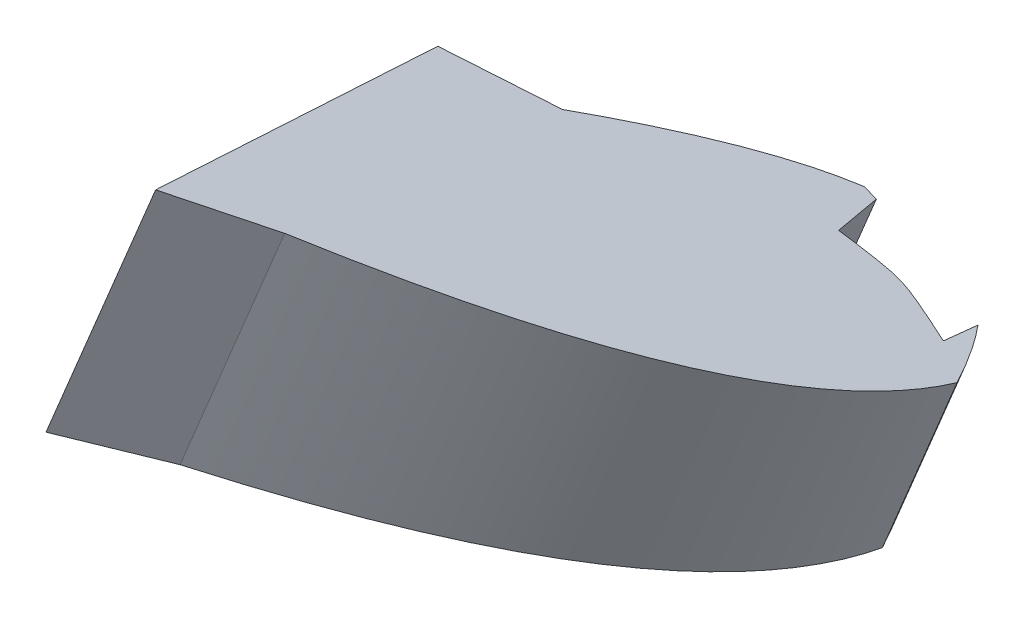
ISO-10303-21;
HEADER;
FILE_DESCRIPTION(('STEP AP214'),'2;1');
FILE_NAME('part.step','',(''),(''),'','','');
FILE_SCHEMA(('AUTOMOTIVE_DESIGN { 1 0 10303 214 1 1 1 1 }'));
ENDSEC;
DATA;
#1=APPLICATION_CONTEXT('core data for automotive mechanical design processes');
#2=APPLICATION_PROTOCOL_DEFINITION('international standard','automotive_design',2000,#1);
#3=PRODUCT_CONTEXT('',#1,'mechanical');
#4=PRODUCT('Part','Part','',(#3));
#5=PRODUCT_RELATED_PRODUCT_CATEGORY('part','',(#4));
#6=PRODUCT_DEFINITION_FORMATION('','',#4);
#7=PRODUCT_DEFINITION_CONTEXT('part definition',#1,'design');
#8=PRODUCT_DEFINITION('design','',#6,#7);
#9=PRODUCT_DEFINITION_SHAPE('','',#8);
#10=(LENGTH_UNIT() NAMED_UNIT(*) SI_UNIT(.MILLI.,.METRE.));
#11=(NAMED_UNIT(*) PLANE_ANGLE_UNIT() SI_UNIT($,.RADIAN.));
#12=(NAMED_UNIT(*) SI_UNIT($,.STERADIAN.) SOLID_ANGLE_UNIT());
#13=UNCERTAINTY_MEASURE_WITH_UNIT(LENGTH_MEASURE(1.E-05),#10,'distance_accuracy_value','');
#14=(GEOMETRIC_REPRESENTATION_CONTEXT(3) GLOBAL_UNCERTAINTY_ASSIGNED_CONTEXT((#13)) GLOBAL_UNIT_ASSIGNED_CONTEXT((#10,
#11,#12)) REPRESENTATION_CONTEXT('',''));
#15=CARTESIAN_POINT('',(0.,0.,0.));
#16=DIRECTION('',(0.,0.,1.));
#17=DIRECTION('',(1.,0.,0.));
#18=AXIS2_PLACEMENT_3D('',#15,#16,#17);
#19=CARTESIAN_POINT('',(-43.998126423093,-18.8210306000009,2.499999999937));
#20=CARTESIAN_POINT('',(-40.0767587944714,-9.35401168793164,2.49999999995365));
#21=CARTESIAN_POINT('',(-46.7697650206304,-17.6729803029027,1.80379381403451));
#22=CARTESIAN_POINT('',(-42.8483973920088,-8.20596139083351,1.80379381405073));
#23=CARTESIAN_POINT('',(-49.5414036181607,-16.5249300058104,2.49999999997486));
#24=CARTESIAN_POINT('',(-45.620035989539,-7.05791109374113,2.49999999999428));
#25=(BOUNDED_SURFACE() B_SPLINE_SURFACE(2,1,((#19,#20),(#21,#22),(#23,#24)),.UNSPECIFIED.,.F.,
.F.,.F.) B_SPLINE_SURFACE_WITH_KNOTS((3,3),(2,2),(0.,1.),(0.,1.),
.UNSPECIFIED.) GEOMETRIC_REPRESENTATION_ITEM() RATIONAL_B_SPLINE_SURFACE(((1.,1.),
(3.23180121851367,3.23180121851367),(1.,1.))) REPRESENTATION_ITEM('') SURFACE());
#26=DIRECTION('',(0.382683432365087,0.923879532511289,1.75275773725978E-12));
#27=VECTOR('',#26,1.);
#28=CARTESIAN_POINT('',(-45.864276932433,-23.3263164690792,2.49999999992723));
#29=LINE('',#28,#27);
#30=CARTESIAN_POINT('',(-43.9748772079036,-18.7649020293759,2.49999999993722));
#31=VERTEX_POINT('',#30);
#32=CARTESIAN_POINT('',(-40.1000080096608,-9.41014025855653,2.49999999995354));
#33=VERTEX_POINT('',#32);
#34=EDGE_CURVE('E11',#31,#33,#29,.T.);
#35=CARTESIAN_POINT('',(-43.9748772079036,-18.764902029376,2.4999999999371));
#36=CARTESIAN_POINT('',(-44.1441960060012,-18.689918733038,2.45713397755878));
#37=CARTESIAN_POINT('',(-44.3136175517458,-18.6150463287689,2.41445643723449));
#38=CARTESIAN_POINT('',(-44.6359575068058,-18.4727763861975,2.33457287865682));
#39=CARTESIAN_POINT('',(-44.7888439602414,-18.4053749317663,2.29724438388191));
#40=CARTESIAN_POINT('',(-45.0742294433284,-18.2796214469319,2.22925837496299));
#41=CARTESIAN_POINT('',(-45.2066814513427,-18.2212818149999,2.1983827102511));
#42=CARTESIAN_POINT('',(-45.4526073408195,-18.1130940658739,2.14333724545787));
#43=CARTESIAN_POINT('',(-45.5660134530771,-18.0632563608652,2.11884832964651));
#44=CARTESIAN_POINT('',(-45.7775214336354,-17.9705727676006,2.07609221582717));
#45=CARTESIAN_POINT('',(-45.8755418307185,-17.927725396652,2.05743401061641));
#46=CARTESIAN_POINT('',(-46.0607637056918,-17.8471864953704,2.02581754669822));
#47=CARTESIAN_POINT('',(-46.1478861685699,-17.8094794863191,2.01244747500349));
#48=CARTESIAN_POINT('',(-46.3162287827627,-17.7371953870861,1.99108008471293));
#49=CARTESIAN_POINT('',(-46.3973955462451,-17.702597773863,1.98275223549235));
#50=CARTESIAN_POINT('',(-46.5188363833495,-17.6513253521998,1.97426315887402));
#51=CARTESIAN_POINT('',(-46.5589036571399,-17.6344882757561,1.97210265216576));
#52=CARTESIAN_POINT('',(-46.6398136583234,-17.6006492441863,1.96913761535577));
#53=CARTESIAN_POINT('',(-46.6806581006547,-17.5836492740698,1.96835648568599));
#54=CARTESIAN_POINT('',(-46.7626125151756,-17.5496922512491,1.96827010909868));
#55=CARTESIAN_POINT('',(-46.8037227731986,-17.5327358681264,1.96897246785804));
#56=CARTESIAN_POINT('',(-46.8852220843218,-17.499284862902,1.97179855206847));
#57=CARTESIAN_POINT('',(-46.9256108921239,-17.4827874049344,1.97389664334203));
#58=CARTESIAN_POINT('',(-47.0480851518441,-17.4330030916098,1.9822143196582));
#59=CARTESIAN_POINT('',(-47.1301416280285,-17.3999783523466,1.9904525415166));
#60=CARTESIAN_POINT('',(-47.3006186280489,-17.3318982709867,2.01167618877233));
#61=CARTESIAN_POINT('',(-47.3890162497119,-17.2968951337547,2.02499209529751));
#62=CARTESIAN_POINT('',(-47.5771926486817,-17.2227573615089,2.05652581112926));
#63=CARTESIAN_POINT('',(-47.6769263608098,-17.1836903127165,2.07515947465734));
#64=CARTESIAN_POINT('',(-47.8923267176656,-17.0995431023758,2.11789459919859));
#65=CARTESIAN_POINT('',(-48.0079362808746,-17.0545225292304,2.14239207411723));
#66=CARTESIAN_POINT('',(-48.2588052621067,-16.956941927987,2.19749261293181));
#67=CARTESIAN_POINT('',(-48.3940087123079,-16.9044231441774,2.22841930403345));
#68=CARTESIAN_POINT('',(-48.6854862403636,-16.7912530982723,2.29655705054913));
#69=CARTESIAN_POINT('',(-48.8417176713024,-16.730626649588,2.33398953120001));
#70=CARTESIAN_POINT('',(-49.1713624408446,-16.6028664941779,2.41413558094473));
#71=CARTESIAN_POINT('',(-49.3447555644009,-16.5357584450804,2.45697371596278));
#72=CARTESIAN_POINT('',(-49.5181544029712,-16.4688014351855,2.49999999997497));
#73=B_SPLINE_CURVE_WITH_KNOTS('',3,(#35,#36,#37,#38,#39,#40,#41,#42,#43,#44,#45,#46,#47,#48,#49,
#50,#51,#52,#53,#54,#55,#56,#57,#58,#59,#60,#61,#62,#63,#64,#65,#66,#67,#68,#69,#70,#71,#72),
.UNSPECIFIED.,.F.,.F.,(4,2,2,2,2,2,2,2,2,2,2,2,2,2,2,2,2,2,4),(0.,0.570235625834093,
1.08384226862801,1.52779463893683,1.90658850363396,2.23232117936545,2.51986191967893,
2.78559885868057,2.91612402279601,3.04884294558912,3.18224395442222,3.31326015892368,
3.57962600844266,3.86756816419204,4.19368983241728,4.57305425999804,5.01796126879909,
5.53309339380046,6.10547806856563),.UNSPECIFIED.);
#74=CARTESIAN_POINT('',(-49.5181544029713,-16.4688014351855,2.49999999997508));
#75=VERTEX_POINT('',#74);
#76=EDGE_CURVE('E252',#31,#75,#73,.T.);
#77=DIRECTION('',(0.382683432365087,0.923879532511289,1.75275773725978E-12));
#78=VECTOR('',#77,1.);
#79=CARTESIAN_POINT('',(-51.4075541275007,-21.0302158748886,2.49999999996642));
#80=LINE('',#79,#78);
#81=CARTESIAN_POINT('',(-45.6432852047285,-7.11403966436603,2.49999999999273));
#82=VERTEX_POINT('',#81);
#83=EDGE_CURVE('E52',#75,#82,#80,.T.);
#84=CARTESIAN_POINT('',(-45.6432852047284,-7.11403966436603,2.49999999999417));
#85=CARTESIAN_POINT('',(-45.4733034039699,-7.18931630580198,2.4569675417673));
#86=CARTESIAN_POINT('',(-45.3032189480743,-7.26448235222831,2.41412323266543));
#87=CARTESIAN_POINT('',(-44.9797547751153,-7.40725055057055,2.33396999929756));
#88=CARTESIAN_POINT('',(-44.8264075243227,-7.47485652730423,2.29653634702487));
#89=CARTESIAN_POINT('',(-44.540275852894,-7.60094123098431,2.2283985926996));
#90=CARTESIAN_POINT('',(-44.4075391578326,-7.65940733774079,2.19747294584205));
#91=CARTESIAN_POINT('',(-44.1611568564664,-7.76779555418798,2.14237528386857));
#92=CARTESIAN_POINT('',(-44.0475800131611,-7.81770726825742,2.11787956211104));
#93=CARTESIAN_POINT('',(-43.835779768405,-7.9105123545508,2.07514796784309));
#94=CARTESIAN_POINT('',(-43.7376388839356,-7.95340753239485,2.05651604976666));
#95=CARTESIAN_POINT('',(-43.5521662786991,-8.0340396877104,2.02498550751966));
#96=CARTESIAN_POINT('',(-43.4649142253352,-8.07179262568208,2.01167104000487));
#97=CARTESIAN_POINT('',(-43.2962392223354,-8.14419277446475,1.99044978823388));
#98=CARTESIAN_POINT('',(-43.2148693849369,-8.1788607298707,1.98221255575299));
#99=CARTESIAN_POINT('',(-43.0930714197467,-8.23025602250833,1.97389591118496));
#100=CARTESIAN_POINT('',(-43.0528491419495,-8.24714831805179,1.97179808805002));
#101=CARTESIAN_POINT('',(-42.9715718988664,-8.28112057993104,1.96897237467957));
#102=CARTESIAN_POINT('',(-42.9305151017157,-8.29819836659283,1.96827011169426));
#103=CARTESIAN_POINT('',(-42.8485529735578,-8.33213674397041,1.96835648882383));
#104=CARTESIAN_POINT('',(-42.8076479069075,-8.34899799286531,1.96913771915974));
#105=CARTESIAN_POINT('',(-42.726502495027,-8.38228352649912,1.97210313432568));
#106=CARTESIAN_POINT('',(-42.6862623401667,-8.39871042684879,1.97426391219909));
#107=CARTESIAN_POINT('',(-42.5641274909734,-8.44832910065065,1.98275402802418));
#108=CARTESIAN_POINT('',(-42.4822643465258,-8.48125998905372,1.99108286912407));
#109=CARTESIAN_POINT('',(-42.3121044342377,-8.54918710325134,2.01245265709763));
#110=CARTESIAN_POINT('',(-42.2238309201739,-8.58413108622148,2.02582416716595));
#111=CARTESIAN_POINT('',(-42.0358977565996,-8.6581575078905,2.05744380077621));
#112=CARTESIAN_POINT('',(-41.9362830514792,-8.6971731622801,2.07610374775436));
#113=CARTESIAN_POINT('',(-41.7211752899773,-8.78119960892744,2.11886338047349));
#114=CARTESIAN_POINT('',(-41.605738803833,-8.82615178030273,2.14335404180078));
#115=CARTESIAN_POINT('',(-41.355334358614,-8.92355137707166,2.19840236424116));
#116=CARTESIAN_POINT('',(-41.2204216763491,-8.97595827230207,2.22927906232333));
#117=CARTESIAN_POINT('',(-40.9297060404861,-9.0888348640838,2.29726504433471));
#118=CARTESIAN_POINT('',(-40.7739450795168,-9.14928008813858,2.33459236050748));
#119=CARTESIAN_POINT('',(-40.4454475084613,-9.27659763911505,2.41446874653152));
#120=CARTESIAN_POINT('',(-40.2727306885249,-9.34344460497427,2.45714013285186));
#121=CARTESIAN_POINT('',(-40.1000080096608,-9.41014025855653,2.49999999995355));
#122=B_SPLINE_CURVE_WITH_KNOTS('',3,(#84,#85,#86,#87,#88,#89,#90,#91,#92,#93,#94,#95,#96,#97,
#98,#99,#100,#101,#102,#103,#104,#105,#106,#107,#108,#109,#110,#111,#112,#113,#114,#115,#116,
#117,#118,#119,#120,#121),.UNSPECIFIED.,.F.,.F.,(4,2,2,2,2,2,2,2,2,2,2,2,2,2,2,2,2,2,4),(0.,
0.572467369661266,1.08761878874473,1.53251624400828,1.91186132912143,2.23796253212292,
2.52588605971483,2.7922350840849,2.92324298910506,3.05663520072196,3.18936289457909,
3.31989635304015,3.58565013279023,3.87320951547109,4.19896263990151,4.57777577935391,
5.02173759074604,5.53532487454691,6.10547806999696),.UNSPECIFIED.);
#123=EDGE_CURVE('E211',#33,#82,#122,.F.);
#124=ORIENTED_EDGE('',*,*,#34,.F.);
#125=ORIENTED_EDGE('',*,*,#76,.T.);
#126=ORIENTED_EDGE('',*,*,#83,.T.);
#127=ORIENTED_EDGE('',*,*,#123,.F.);
#128=EDGE_LOOP('',(#124,#125,#126,#127));
#129=FACE_BOUND('',#128,.T.);
#130=ADVANCED_FACE('F16',(#129),#25,.T.);
#131=CARTESIAN_POINT('',(-45.864276932433,-23.3263164690792,2.49999999992723));
#132=DIRECTION('',(-0.923316730062639,0.382450311957987,-0.0348994966965405));
#133=DIRECTION('',(-0.0377709966946393,0.,0.999286421307068));
#134=AXIS2_PLACEMENT_3D('',#131,#132,#133);
#135=PLANE('',#134);
#136=DIRECTION('',(0.382683432365087,0.923879532511289,1.75275773725978E-12));
#137=VECTOR('',#136,1.);
#138=CARTESIAN_POINT('',(-45.8046947616248,-23.3509962123001,0.653211709660262));
#139=LINE('',#138,#137);
#140=CARTESIAN_POINT('',(-43.8410141738853,-18.6102518822556,0.653211709669255));
#141=VERTEX_POINT('',#140);
#142=CARTESIAN_POINT('',(-40.1147067182942,-9.61414988539547,0.653211709686241));
#143=VERTEX_POINT('',#142);
#144=EDGE_CURVE('E29',#141,#143,#139,.T.);
#145=ORIENTED_EDGE('',*,*,#144,.F.);
#146=DIRECTION('',(-0.0720437233054021,-0.0832311361385315,0.993922673002974));
#147=VECTOR('',#146,1.);
#148=CARTESIAN_POINT('',(-44.0120352781172,-18.8078302437812,3.01263658749673));
#149=LINE('',#148,#147);
#150=EDGE_CURVE('E244',#141,#31,#149,.T.);
#151=ORIENTED_EDGE('',*,*,#150,.T.);
#152=ORIENTED_EDGE('',*,*,#34,.T.);
#153=DIRECTION('',(0.00791069547691085,0.109795906057388,0.99392267300334));
#154=VECTOR('',#153,1.);
#155=CARTESIAN_POINT('',(-40.112455793967,-9.58290834959068,0.936024356267606));
#156=LINE('',#155,#154);
#157=EDGE_CURVE('E274',#143,#33,#156,.T.);
#158=ORIENTED_EDGE('',*,*,#157,.F.);
#159=EDGE_LOOP('',(#145,#151,#152,#158));
#160=FACE_BOUND('',#159,.T.);
#161=ADVANCED_FACE('F324',(#160),#135,.T.);
#162=CARTESIAN_POINT('',(-42.3892208390751,-19.5986096640974,3.46542473270606));
#163=CARTESIAN_POINT('',(-38.3892593165955,-9.94184830755682,3.46542473272426));
#164=CARTESIAN_POINT('',(-43.1578042398419,-19.2802519956817,1.74103164453687));
#165=CARTESIAN_POINT('',(-39.1578427173624,-9.62349063914111,1.74103164455508));
#166=CARTESIAN_POINT('',(-43.9778412024725,-18.9405815641108,0.653211705365475));
#167=CARTESIAN_POINT('',(-39.977879679993,-9.28382020757025,0.653211705383794));
#168=(BOUNDED_SURFACE() B_SPLINE_SURFACE(2,1,((#162,#163),(#164,#165),(#166,#167)),
.UNSPECIFIED.,.F.,.F.,.F.) B_SPLINE_SURFACE_WITH_KNOTS((3,3),(2,2),(0.498970870983995,
0.499370559848929),(0.,1.),
.UNSPECIFIED.) GEOMETRIC_REPRESENTATION_ITEM() RATIONAL_B_SPLINE_SURFACE(((1.,1.),(1.,1.),(1.,1.))) REPRESENTATION_ITEM('') SURFACE());
#169=DIRECTION('',(0.382683432365087,0.923879532511289,1.75275773725978E-12));
#170=VECTOR('',#169,1.);
#171=CARTESIAN_POINT('',(-44.2160744002341,-24.0090243114554,3.46542473202216));
#172=LINE('',#171,#170);
#173=CARTESIAN_POINT('',(-42.3655056521761,-19.5413561382697,3.4654247326813));
#174=VERTEX_POINT('',#173);
#175=CARTESIAN_POINT('',(-38.4129745034929,-9.99910183338225,3.46542473266931));
#176=VERTEX_POINT('',#175);
#177=EDGE_CURVE('E188',#174,#176,#172,.T.);
#178=CARTESIAN_POINT('',(-42.3655056521761,-19.5413561382697,3.4654247326813));
#179=CARTESIAN_POINT('',(-42.8316559674868,-19.2174877790016,2.31582932975005));
#180=CARTESIAN_POINT('',(-43.323492140092,-18.9071196942011,1.37842499130636));
#181=CARTESIAN_POINT('',(-43.8410141738853,-18.6102518822556,0.653211709669255));
#182=(BOUNDED_CURVE() B_SPLINE_CURVE(3,(#178,#179,#180,#181),.UNSPECIFIED.,.F.,
.F.) B_SPLINE_CURVE_WITH_KNOTS((4,4),(0.,1.),
.UNSPECIFIED.) CURVE() GEOMETRIC_REPRESENTATION_ITEM() RATIONAL_B_SPLINE_CURVE((1.,1.,1.,1.)) REPRESENTATION_ITEM(''));
#183=EDGE_CURVE('E254',#174,#141,#182,.T.);
#184=CARTESIAN_POINT('',(-38.4129745034929,-9.99910183338225,3.46542473266931));
#185=CARTESIAN_POINT('',(-38.9716020722142,-9.89849329622184,2.31582931598706));
#186=CARTESIAN_POINT('',(-39.5388461438147,-9.77017598022625,1.37842497499419));
#187=CARTESIAN_POINT('',(-40.1147067182942,-9.61414988539547,0.653211709686241));
#188=(BOUNDED_CURVE() B_SPLINE_CURVE(3,(#184,#185,#186,#187),.UNSPECIFIED.,.F.,
.F.) B_SPLINE_CURVE_WITH_KNOTS((4,4),(0.,1.),
.UNSPECIFIED.) CURVE() GEOMETRIC_REPRESENTATION_ITEM() RATIONAL_B_SPLINE_CURVE((1.,1.,1.,1.)) REPRESENTATION_ITEM(''));
#189=EDGE_CURVE('E267',#176,#143,#188,.T.);
#190=ORIENTED_EDGE('',*,*,#177,.F.);
#191=ORIENTED_EDGE('',*,*,#183,.T.);
#192=ORIENTED_EDGE('',*,*,#144,.T.);
#193=ORIENTED_EDGE('',*,*,#189,.F.);
#194=EDGE_LOOP('',(#190,#191,#192,#193));
#195=FACE_BOUND('',#194,.T.);
#196=ADVANCED_FACE('F235',(#195),#168,.T.);
#197=CARTESIAN_POINT('',(-59.8232234491169,-14.651748478847,23.2218347925675));
#198=CARTESIAN_POINT('',(-54.2149198750995,-1.11210592854838,23.2218347925931));
#199=CARTESIAN_POINT('',(-45.0003686640836,-20.791575963874,12.2908756265575));
#200=CARTESIAN_POINT('',(-39.3920650900662,-7.25193341357539,12.2908756265832));
#201=CARTESIAN_POINT('',(-43.1933918638165,-21.5400502614214,3.4654247328888));
#202=CARTESIAN_POINT('',(-37.5850882897991,-8.00040771112283,3.465424732913));
#203=(BOUNDED_SURFACE() B_SPLINE_SURFACE(2,1,((#197,#198),(#199,#200),(#201,#202)),
.UNSPECIFIED.,.F.,.F.,.F.) B_SPLINE_SURFACE_WITH_KNOTS((3,3),(2,2),(0.497683812669217,
0.499570923629333),(0.,1.),
.UNSPECIFIED.) GEOMETRIC_REPRESENTATION_ITEM() RATIONAL_B_SPLINE_SURFACE(((1.,1.),(1.,1.),(1.,1.))) REPRESENTATION_ITEM('') SURFACE());
#204=DIRECTION('',(0.382683432365087,0.923879532511289,1.75275773725978E-12));
#205=VECTOR('',#204,1.);
#206=CARTESIAN_POINT('',(-60.8459059857371,-17.1207225287971,23.2218347925797));
#207=LINE('',#206,#205);
#208=CARTESIAN_POINT('',(-59.7899726373755,-14.5714739182552,23.2218347925977));
#209=VERTEX_POINT('',#208);
#210=CARTESIAN_POINT('',(-54.2481706867326,-1.19238048914556,23.2218347925717));
#211=VERTEX_POINT('',#210);
#212=EDGE_CURVE('E189',#209,#211,#207,.T.);
#213=CARTESIAN_POINT('',(-59.7899726373755,-14.5714739182552,23.2218347925977));
#214=CARTESIAN_POINT('',(-49.6149619940267,-17.9570682006105,15.934528695419));
#215=CARTESIAN_POINT('',(-43.8068063158397,-19.6136956140975,9.34905867292202));
#216=CARTESIAN_POINT('',(-42.3655056521761,-19.5413561382697,3.4654247326813));
#217=(BOUNDED_CURVE() B_SPLINE_CURVE(3,(#213,#214,#215,#216),.UNSPECIFIED.,.F.,
.F.) B_SPLINE_CURVE_WITH_KNOTS((4,4),(0.,1.),
.UNSPECIFIED.) CURVE() GEOMETRIC_REPRESENTATION_ITEM() RATIONAL_B_SPLINE_CURVE((1.,1.,1.,1.)) REPRESENTATION_ITEM(''));
#218=EDGE_CURVE('E286',#209,#174,#217,.T.);
#219=CARTESIAN_POINT('',(-54.2481706867326,-1.19238048914556,23.2218347925717));
#220=CARTESIAN_POINT('',(-44.6593749557795,-5.99322285379242,15.9345286718843));
#221=CARTESIAN_POINT('',(-39.3809762280331,-8.92879663520458,9.34905865191682));
#222=CARTESIAN_POINT('',(-38.4129745034929,-9.99910183338225,3.46542473266931));
#223=(BOUNDED_CURVE() B_SPLINE_CURVE(3,(#219,#220,#221,#222),.UNSPECIFIED.,.F.,
.F.) B_SPLINE_CURVE_WITH_KNOTS((4,4),(0.,1.),
.UNSPECIFIED.) CURVE() GEOMETRIC_REPRESENTATION_ITEM() RATIONAL_B_SPLINE_CURVE((1.,1.,1.,1.)) REPRESENTATION_ITEM(''));
#224=EDGE_CURVE('E166',#211,#176,#223,.T.);
#225=ORIENTED_EDGE('',*,*,#212,.F.);
#226=ORIENTED_EDGE('',*,*,#218,.T.);
#227=ORIENTED_EDGE('',*,*,#177,.T.);
#228=ORIENTED_EDGE('',*,*,#224,.F.);
#229=EDGE_LOOP('',(#225,#226,#227,#228));
#230=FACE_BOUND('',#229,.T.);
#231=ADVANCED_FACE('F310',(#230),#203,.T.);
#232=CARTESIAN_POINT('',(-60.8459059857371,-17.1207225287971,23.2218347925797));
#233=DIRECTION('',(0.584753402377201,-0.242212789909909,0.774206963810285));
#234=DIRECTION('',(-0.382683432367064,-0.923879532510469,0.));
#235=AXIS2_PLACEMENT_3D('',#232,#233,#234);
#236=PLANE('',#235);
#237=DIRECTION('',(0.382683432365087,0.923879532511289,1.75275773725978E-12));
#238=VECTOR('',#237,1.);
#239=CARTESIAN_POINT('',(-64.5414241159697,-15.5899887992652,26.4919294904875));
#240=LINE('',#239,#238);
#241=CARTESIAN_POINT('',(-63.6170193704147,-13.3582783254241,26.4919294904917));
#242=VERTEX_POINT('',#241);
#243=CARTESIAN_POINT('',(-57.8121602142231,0.655891377119524,26.4919294905183));
#244=VERTEX_POINT('',#243);
#245=EDGE_CURVE('E187',#242,#244,#240,.T.);
#246=ORIENTED_EDGE('',*,*,#245,.F.);
#247=DIRECTION('',(0.739097950907789,-0.234298256399335,-0.631536654527774));
#248=VECTOR('',#247,1.);
#249=CARTESIAN_POINT('',(-59.9253411391994,-14.5285613328371,23.3375030482709));
#250=LINE('',#249,#248);
#251=EDGE_CURVE('E165',#242,#209,#250,.T.);
#252=ORIENTED_EDGE('',*,*,#251,.T.);
#253=ORIENTED_EDGE('',*,*,#212,.T.);
#254=DIRECTION('',(0.688295058968979,-0.356947287125785,-0.631536654528006));
#255=VECTOR('',#254,1.);
#256=CARTESIAN_POINT('',(-53.4604927917755,-1.60086734964381,22.4991106408409));
#257=LINE('',#256,#255);
#258=EDGE_CURVE('E179',#244,#211,#257,.T.);
#259=ORIENTED_EDGE('',*,*,#258,.F.);
#260=EDGE_LOOP('',(#246,#252,#253,#259));
#261=FACE_BOUND('',#260,.T.);
#262=ADVANCED_FACE('F305',(#261),#236,.T.);
#263=CARTESIAN_POINT('',(-64.5414241159697,-15.5899887992652,26.4919294904875));
#264=DIRECTION('',(-0.923879532511288,0.382683432365088,6.5272817776803E-12));
#265=DIRECTION('',(7.06818712244004E-12,0.,0.999999999999997));
#266=AXIS2_PLACEMENT_3D('',#263,#264,#265);
#267=PLANE('',#266);
#268=DIRECTION('',(0.382683432365087,0.923879532511289,1.75275773725978E-12));
#269=VECTOR('',#268,1.);
#270=CARTESIAN_POINT('',(-64.5414241160534,-15.5899887992012,10.9277135759431));
#271=LINE('',#270,#269);
#272=CARTESIAN_POINT('',(-62.9910009331233,-11.8469361235537,10.9277135759501));
#273=VERTEX_POINT('',#272);
#274=CARTESIAN_POINT('',(-58.4381786516818,-0.855450824622867,10.927713575971));
#275=VERTEX_POINT('',#274);
#276=EDGE_CURVE('E137',#273,#275,#271,.T.);
#277=ORIENTED_EDGE('',*,*,#276,.F.);
#278=DIRECTION('',(-0.0400013110977776,-0.0965717077819282,0.994521895368088));
#279=VECTOR('',#278,1.);
#280=CARTESIAN_POINT('',(-63.6271196012051,-13.3826624395856,26.7430437763394));
#281=LINE('',#280,#279);
#282=EDGE_CURVE('E155',#273,#242,#281,.T.);
#283=ORIENTED_EDGE('',*,*,#282,.T.);
#284=ORIENTED_EDGE('',*,*,#245,.T.);
#285=DIRECTION('',(0.040001311108447,0.0965717077737515,0.994521895368454));
#286=VECTOR('',#285,1.);
#287=CARTESIAN_POINT('',(-57.8856854950071,0.47838564710456,24.6639268681882));
#288=LINE('',#287,#286);
#289=EDGE_CURVE('E183',#275,#244,#288,.T.);
#290=ORIENTED_EDGE('',*,*,#289,.F.);
#291=EDGE_LOOP('',(#277,#283,#284,#290));
#292=FACE_BOUND('',#291,.T.);
#293=ADVANCED_FACE('F315',(#292),#267,.T.);
#294=CARTESIAN_POINT('',(-60.2552211978261,-17.3653921790094,8.51725167506867));
#295=DIRECTION('',(-0.425955925733507,0.176436721413681,-0.887373446001906));
#296=DIRECTION('',(-0.901516449808071,0.,0.432744833274121));
#297=AXIS2_PLACEMENT_3D('',#294,#295,#296);
#298=PLANE('',#297);
#299=DIRECTION('',(0.382683432365087,0.923879532511289,1.75275773725978E-12));
#300=VECTOR('',#299,1.);
#301=CARTESIAN_POINT('',(-60.2552212065647,-17.3653921753898,8.51725168689144));
#302=LINE('',#301,#300);
#303=CARTESIAN_POINT('',(-58.6078452701051,-13.3882748472621,8.51725167999051));
#304=VERTEX_POINT('',#303);
#305=CARTESIAN_POINT('',(-54.2489284957224,-2.86491885329172,8.5172516800105));
#306=VERTEX_POINT('',#305);
#307=EDGE_CURVE('E126',#304,#306,#302,.T.);
#308=ORIENTED_EDGE('',*,*,#307,.F.);
#309=DIRECTION('',(-0.837387801597421,0.294467809175283,0.46051099780064));
#310=VECTOR('',#309,1.);
#311=CARTESIAN_POINT('',(-58.7823229542742,-13.3269196886257,8.61320351052519));
#312=LINE('',#311,#310);
#313=EDGE_CURVE('E133',#304,#273,#312,.T.);
#314=ORIENTED_EDGE('',*,*,#313,.T.);
#315=ORIENTED_EDGE('',*,*,#276,.T.);
#316=DIRECTION('',(-0.800342777702037,0.383902408281955,0.46051099780081));
#317=VECTOR('',#316,1.);
#318=CARTESIAN_POINT('',(-53.640929177852,-3.15655939640308,8.16741361020545));
#319=LINE('',#318,#317);
#320=EDGE_CURVE('E135',#306,#275,#319,.T.);
#321=ORIENTED_EDGE('',*,*,#320,.F.);
#322=EDGE_LOOP('',(#308,#314,#315,#321));
#323=FACE_BOUND('',#322,.T.);
#324=ADVANCED_FACE('F128',(#323),#298,.T.);
#325=CARTESIAN_POINT('',(-50.815870890754,-16.6897895834762,-3.97459842815806E-11));
#326=CARTESIAN_POINT('',(-46.4046471150775,-6.04015331757505,-1.95399252334028E-11));
#327=CARTESIAN_POINT('',(-54.056356540409,-15.3475364787181,2.27037554791365));
#328=CARTESIAN_POINT('',(-49.6451327647323,-4.69790021281693,2.27037554793386));
#329=CARTESIAN_POINT('',(-58.6339987676124,-13.4514149845305,8.51725168266249));
#330=CARTESIAN_POINT('',(-54.2227749919358,-2.80177871862925,8.51725168268269));
#331=(BOUNDED_SURFACE() B_SPLINE_SURFACE(2,1,((#325,#326),(#327,#328),(#329,#330)),
.UNSPECIFIED.,.F.,.F.,.F.) B_SPLINE_SURFACE_WITH_KNOTS((3,3),(2,2),(0.500810137023701,
0.501838692264888),(0.,1.),
.UNSPECIFIED.) GEOMETRIC_REPRESENTATION_ITEM() RATIONAL_B_SPLINE_SURFACE(((1.,1.),(1.,1.),(1.,1.))) REPRESENTATION_ITEM('') SURFACE());
#332=DIRECTION('',(0.382683432365087,0.923879532511289,1.75275773725978E-12));
#333=VECTOR('',#332,1.);
#334=CARTESIAN_POINT('',(-52.4370933265974,-20.6037667756234,-2.95319324550292E-11));
#335=LINE('',#334,#333);
#336=CARTESIAN_POINT('',(-50.4471394782991,-15.7995932065646,-1.57651669496772E-11));
#337=VERTEX_POINT('',#336);
#338=CARTESIAN_POINT('',(-46.7733785275941,-6.93034969445629,1.11022302462516E-12));
#339=VERTEX_POINT('',#338);
#340=EDGE_CURVE('E139',#337,#339,#335,.T.);
#341=CARTESIAN_POINT('',(-50.4471394782991,-15.7995932065646,-1.57651669496772E-11));
#342=CARTESIAN_POINT('',(-52.668342067458,-15.0517323112076,1.51358369160104));
#343=CARTESIAN_POINT('',(-55.388577326236,-14.2479595269097,4.35266757357822));
#344=CARTESIAN_POINT('',(-58.6078452701051,-13.3882748472621,8.51725167999051));
#345=(BOUNDED_CURVE() B_SPLINE_CURVE(3,(#341,#342,#343,#344),.UNSPECIFIED.,.F.,
.F.) B_SPLINE_CURVE_WITH_KNOTS((4,4),(0.,1.),
.UNSPECIFIED.) CURVE() GEOMETRIC_REPRESENTATION_ITEM() RATIONAL_B_SPLINE_CURVE((1.,1.,1.,1.)) REPRESENTATION_ITEM(''));
#346=EDGE_CURVE('E142',#337,#304,#345,.T.);
#347=CARTESIAN_POINT('',(-46.7733785275941,-6.93034969445629,1.11022302462516E-12));
#348=CARTESIAN_POINT('',(-48.8728234145586,-5.88853980999184,1.5135836650334));
#349=CARTESIAN_POINT('',(-51.3646734039347,-4.53339619627031,4.35266755837038));
#350=CARTESIAN_POINT('',(-54.2489284957224,-2.86491885329172,8.5172516800105));
#351=(BOUNDED_CURVE() B_SPLINE_CURVE(3,(#347,#348,#349,#350),.UNSPECIFIED.,.F.,
.F.) B_SPLINE_CURVE_WITH_KNOTS((4,4),(0.,1.),
.UNSPECIFIED.) CURVE() GEOMETRIC_REPRESENTATION_ITEM() RATIONAL_B_SPLINE_CURVE((1.,1.,1.,1.)) REPRESENTATION_ITEM(''));
#352=EDGE_CURVE('E147',#339,#306,#351,.T.);
#353=ORIENTED_EDGE('',*,*,#340,.F.);
#354=ORIENTED_EDGE('',*,*,#346,.T.);
#355=ORIENTED_EDGE('',*,*,#307,.T.);
#356=ORIENTED_EDGE('',*,*,#352,.F.);
#357=EDGE_LOOP('',(#353,#354,#355,#356));
#358=FACE_BOUND('',#357,.T.);
#359=ADVANCED_FACE('F143',(#358),#331,.T.);
#360=CARTESIAN_POINT('',(-51.8148163487793,-20.8615223393882,-2.93098878501041E-11));
#361=DIRECTION('',(8.79599015298817E-13,1.52468502113392E-12,-0.999999999999997));
#362=DIRECTION('',(-0.999999999999998,0.,-8.84015174850124E-13));
#363=AXIS2_PLACEMENT_3D('',#360,#361,#362);
#364=PLANE('',#363);
#365=DIRECTION('',(0.382683432365087,0.923879532511289,1.75275773725978E-12));
#366=VECTOR('',#365,1.);
#367=CARTESIAN_POINT('',(-51.8148163487793,-20.8615223393882,-2.93098878501041E-11));
#368=LINE('',#367,#366);
#369=CARTESIAN_POINT('',(-49.8248625004808,-16.0573487703294,-2.02060590481778E-11));
#370=VERTEX_POINT('',#369);
#371=CARTESIAN_POINT('',(-46.1511015497761,-7.18810525822102,-3.5527136788005E-12));
#372=VERTEX_POINT('',#371);
#373=EDGE_CURVE('E45',#370,#372,#368,.T.);
#374=ORIENTED_EDGE('',*,*,#373,.F.);
#375=DIRECTION('',(-0.923879532511288,0.382683432365088,6.5272817776803E-12));
#376=VECTOR('',#375,1.);
#377=CARTESIAN_POINT('',(-23.5480494893671,-26.9415610954745,-2.05835348765504E-10));
#378=LINE('',#377,#376);
#379=EDGE_CURVE('E256',#370,#337,#378,.T.);
#380=ORIENTED_EDGE('',*,*,#379,.T.);
#381=ORIENTED_EDGE('',*,*,#340,.T.);
#382=DIRECTION('',(-0.923879532511288,0.382683432365088,6.5272817776803E-12));
#383=VECTOR('',#382,1.);
#384=CARTESIAN_POINT('',(-19.8742885386623,-18.0723175833661,-1.88959958791202E-10));
#385=LINE('',#384,#383);
#386=EDGE_CURVE('E193',#372,#339,#385,.T.);
#387=ORIENTED_EDGE('',*,*,#386,.F.);
#388=EDGE_LOOP('',(#374,#380,#381,#387));
#389=FACE_BOUND('',#388,.T.);
#390=ADVANCED_FACE('F357',(#389),#364,.T.);
#391=CARTESIAN_POINT('',(-51.4075541275007,-21.0302158748886,2.49999999996642));
#392=DIRECTION('',(0.909843726465477,-0.376869611141748,-0.173648177673354));
#393=DIRECTION('',(0.,0.418478680395554,-0.908226620428177));
#394=AXIS2_PLACEMENT_3D('',#391,#392,#393);
#395=PLANE('',#394);
#396=ORIENTED_EDGE('',*,*,#83,.F.);
#397=DIRECTION('',(-0.120177342352754,0.161219374929618,-0.979574254220846));
#398=VECTOR('',#397,1.);
#399=CARTESIAN_POINT('',(-49.457065213692,-16.550753329925,2.99794242287899));
#400=LINE('',#399,#398);
#401=EDGE_CURVE('E251',#75,#370,#400,.T.);
#402=ORIENTED_EDGE('',*,*,#401,.T.);
#403=ORIENTED_EDGE('',*,*,#373,.T.);
#404=DIRECTION('',(-0.19897752699269,-0.0290210995456221,-0.979574254221206));
#405=VECTOR('',#404,1.);
#406=CARTESIAN_POINT('',(-45.951864072428,-7.15904624461927,0.980854000122933));
#407=LINE('',#406,#405);
#408=EDGE_CURVE('E191',#82,#372,#407,.T.);
#409=ORIENTED_EDGE('',*,*,#408,.F.);
#410=EDGE_LOOP('',(#396,#402,#403,#409));
#411=FACE_BOUND('',#410,.T.);
#412=ADVANCED_FACE('F228',(#411),#395,.T.);
#413=CARTESIAN_POINT('',(-19.8742885386623,-18.0723175833661,-1.88959958791202E-10));
#414=DIRECTION('',(-0.380587052481203,-0.918818423765512,0.104528463265906));
#415=DIRECTION('',(-0.923879532511548,0.382683432364453,0.));
#416=AXIS2_PLACEMENT_3D('',#413,#414,#415);
#417=PLANE('',#416);
#418=ORIENTED_EDGE('',*,*,#352,.T.);
#419=ORIENTED_EDGE('',*,*,#320,.T.);
#420=ORIENTED_EDGE('',*,*,#289,.T.);
#421=ORIENTED_EDGE('',*,*,#258,.T.);
#422=ORIENTED_EDGE('',*,*,#224,.T.);
#423=ORIENTED_EDGE('',*,*,#189,.T.);
#424=ORIENTED_EDGE('',*,*,#157,.T.);
#425=ORIENTED_EDGE('',*,*,#123,.T.);
#426=ORIENTED_EDGE('',*,*,#408,.T.);
#427=ORIENTED_EDGE('',*,*,#386,.T.);
#428=EDGE_LOOP('',(#418,#419,#420,#421,#422,#423,#424,#425,#426,#427));
#429=FACE_BOUND('',#428,.T.);
#430=ADVANCED_FACE('F219',(#429),#417,.F.);
#431=CARTESIAN_POINT('',(-23.5480494893671,-26.9415610954745,-2.05835348765504E-10));
#432=DIRECTION('',(-0.380587052482324,-0.918818423764653,-0.104528463269393));
#433=DIRECTION('',(-0.923879532511025,0.382683432365721,0.));
#434=AXIS2_PLACEMENT_3D('',#431,#432,#433);
#435=PLANE('',#434);
#436=ORIENTED_EDGE('',*,*,#379,.F.);
#437=ORIENTED_EDGE('',*,*,#401,.F.);
#438=ORIENTED_EDGE('',*,*,#76,.F.);
#439=ORIENTED_EDGE('',*,*,#150,.F.);
#440=ORIENTED_EDGE('',*,*,#183,.F.);
#441=ORIENTED_EDGE('',*,*,#218,.F.);
#442=ORIENTED_EDGE('',*,*,#251,.F.);
#443=ORIENTED_EDGE('',*,*,#282,.F.);
#444=ORIENTED_EDGE('',*,*,#313,.F.);
#445=ORIENTED_EDGE('',*,*,#346,.F.);
#446=EDGE_LOOP('',(#436,#437,#438,#439,#440,#441,#442,#443,#444,#445));
#447=FACE_BOUND('',#446,.T.);
#448=ADVANCED_FACE('F153',(#447),#435,.T.);
#449=CLOSED_SHELL('',(#130,#161,#196,#231,#262,#293,#324,#359,#390,#412,#430,#448));
#450=MANIFOLD_SOLID_BREP('B1',#449);
#451=ADVANCED_BREP_SHAPE_REPRESENTATION('',(#18,#450),#14);
#452=SHAPE_DEFINITION_REPRESENTATION(#9,#451);
ENDSEC;
END-ISO-10303-21;
